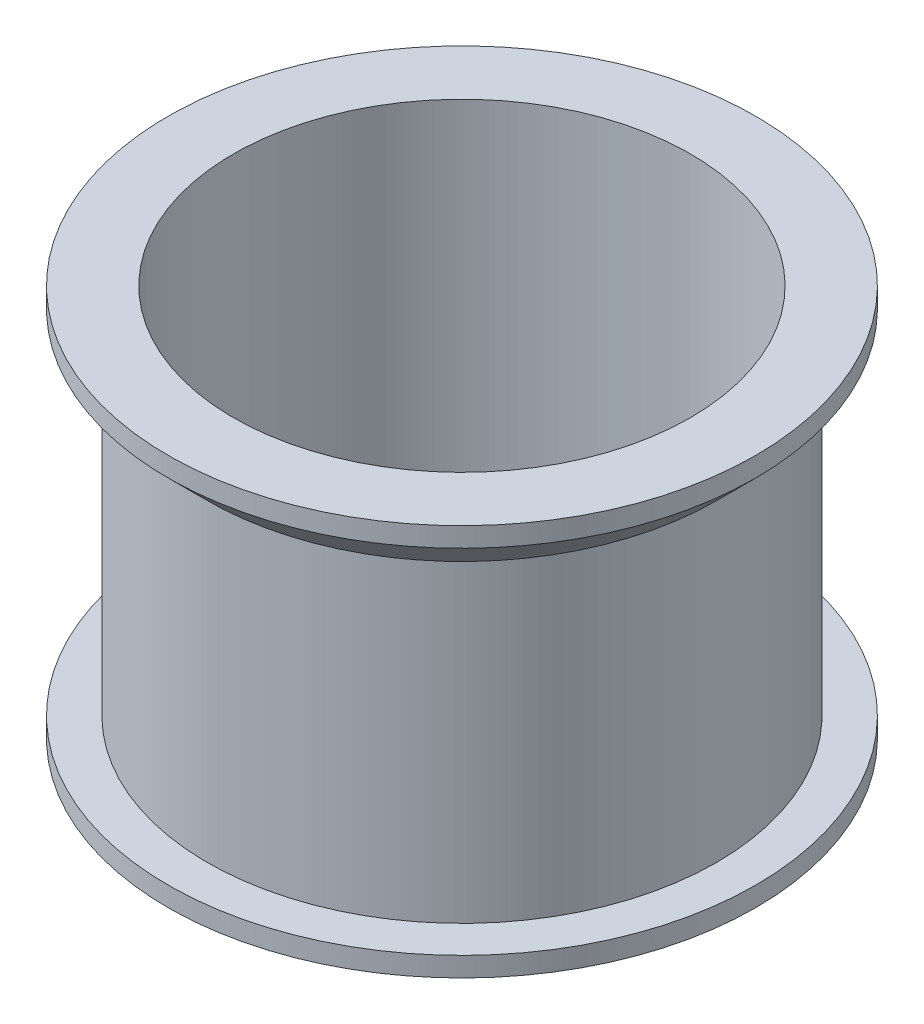
ISO-10303-21;
HEADER;
FILE_DESCRIPTION(('STEP AP214'),'2;1');
FILE_NAME('part.step','',(''),(''),'','','');
FILE_SCHEMA(('AUTOMOTIVE_DESIGN { 1 0 10303 214 1 1 1 1 }'));
ENDSEC;
DATA;
#1=APPLICATION_CONTEXT('core data for automotive mechanical design processes');
#2=APPLICATION_PROTOCOL_DEFINITION('international standard','automotive_design',2000,#1);
#3=PRODUCT_CONTEXT('',#1,'mechanical');
#4=PRODUCT('Part','Part','',(#3));
#5=PRODUCT_RELATED_PRODUCT_CATEGORY('part','',(#4));
#6=PRODUCT_DEFINITION_FORMATION('','',#4);
#7=PRODUCT_DEFINITION_CONTEXT('part definition',#1,'design');
#8=PRODUCT_DEFINITION('design','',#6,#7);
#9=PRODUCT_DEFINITION_SHAPE('','',#8);
#10=(LENGTH_UNIT() NAMED_UNIT(*) SI_UNIT(.MILLI.,.METRE.));
#11=(NAMED_UNIT(*) PLANE_ANGLE_UNIT() SI_UNIT($,.RADIAN.));
#12=(NAMED_UNIT(*) SI_UNIT($,.STERADIAN.) SOLID_ANGLE_UNIT());
#13=UNCERTAINTY_MEASURE_WITH_UNIT(LENGTH_MEASURE(1.E-05),#10,'distance_accuracy_value','');
#14=(GEOMETRIC_REPRESENTATION_CONTEXT(3) GLOBAL_UNCERTAINTY_ASSIGNED_CONTEXT((#13)) GLOBAL_UNIT_ASSIGNED_CONTEXT((#10,
#11,#12)) REPRESENTATION_CONTEXT('',''));
#15=CARTESIAN_POINT('',(0.,0.,0.));
#16=DIRECTION('',(0.,0.,1.));
#17=DIRECTION('',(1.,0.,0.));
#18=AXIS2_PLACEMENT_3D('',#15,#16,#17);
#19=CARTESIAN_POINT('',(0.,166.,45.));
#20=DIRECTION('',(0.,1.,0.));
#21=DIRECTION('',(0.,0.,-1.));
#22=AXIS2_PLACEMENT_3D('',#19,#20,#21);
#23=PLANE('',#22);
#24=CARTESIAN_POINT('',(0.,166.,45.));
#25=DIRECTION('',(0.,1.,0.));
#26=DIRECTION('',(1.,0.,0.));
#27=AXIS2_PLACEMENT_3D('',#24,#25,#26);
#28=CIRCLE('',#27,16.);
#29=CARTESIAN_POINT('',(16.,166.,45.));
#30=VERTEX_POINT('',#29);
#31=EDGE_CURVE('E123',#30,#30,#28,.T.);
#32=ORIENTED_EDGE('',*,*,#31,.F.);
#33=EDGE_LOOP('',(#32));
#34=FACE_BOUND('',#33,.T.);
#35=CARTESIAN_POINT('',(0.,166.,45.));
#36=DIRECTION('',(0.,1.,0.));
#37=DIRECTION('',(1.,0.,0.));
#38=AXIS2_PLACEMENT_3D('',#35,#36,#37);
#39=CIRCLE('',#38,35.);
#40=CARTESIAN_POINT('',(35.,166.,45.));
#41=VERTEX_POINT('',#40);
#42=EDGE_CURVE('E11',#41,#41,#39,.T.);
#43=ORIENTED_EDGE('',*,*,#42,.T.);
#44=EDGE_LOOP('',(#43));
#45=FACE_BOUND('',#44,.T.);
#46=ADVANCED_FACE('F16',(#34,#45),#23,.T.);
#47=CARTESIAN_POINT('',(0.,220.,45.));
#48=DIRECTION('',(0.,-1.,0.));
#49=DIRECTION('',(1.,0.,0.));
#50=AXIS2_PLACEMENT_3D('',#47,#48,#49);
#51=CYLINDRICAL_SURFACE('',#50,35.);
#52=CARTESIAN_POINT('',(0.,220.,45.));
#53=DIRECTION('',(0.,1.,0.));
#54=DIRECTION('',(1.,0.,0.));
#55=AXIS2_PLACEMENT_3D('',#52,#53,#54);
#56=CIRCLE('',#55,35.);
#57=CARTESIAN_POINT('',(35.,220.,45.));
#58=VERTEX_POINT('',#57);
#59=EDGE_CURVE('E183',#58,#58,#56,.T.);
#60=ORIENTED_EDGE('',*,*,#59,.T.);
#61=DIRECTION('',(0.,-1.,0.));
#62=VECTOR('',#61,1.);
#63=CARTESIAN_POINT('',(35.,220.,45.));
#64=LINE('',#63,#62);
#65=EDGE_CURVE('E25',#58,#41,#64,.T.);
#66=ORIENTED_EDGE('',*,*,#65,.T.);
#67=ORIENTED_EDGE('',*,*,#42,.F.);
#68=ORIENTED_EDGE('',*,*,#65,.F.);
#69=EDGE_LOOP('',(#60,#66,#67,#68));
#70=FACE_BOUND('',#69,.T.);
#71=ADVANCED_FACE('F18',(#70),#51,.F.);
#72=CARTESIAN_POINT('',(0.,166.,45.));
#73=DIRECTION('',(0.,1.,0.));
#74=DIRECTION('',(1.,0.,0.));
#75=AXIS2_PLACEMENT_3D('',#72,#73,#74);
#76=CYLINDRICAL_SURFACE('',#75,16.);
#77=ORIENTED_EDGE('',*,*,#31,.T.);
#78=DIRECTION('',(0.,1.,0.));
#79=VECTOR('',#78,1.);
#80=CARTESIAN_POINT('',(16.,166.,45.));
#81=LINE('',#80,#79);
#82=CARTESIAN_POINT('',(16.,180.,45.));
#83=VERTEX_POINT('',#82);
#84=EDGE_CURVE('E42',#30,#83,#81,.T.);
#85=ORIENTED_EDGE('',*,*,#84,.T.);
#86=CARTESIAN_POINT('',(0.,180.,45.));
#87=DIRECTION('',(0.,1.,0.));
#88=DIRECTION('',(1.,0.,0.));
#89=AXIS2_PLACEMENT_3D('',#86,#87,#88);
#90=CIRCLE('',#89,16.);
#91=EDGE_CURVE('E179',#83,#83,#90,.T.);
#92=ORIENTED_EDGE('',*,*,#91,.F.);
#93=ORIENTED_EDGE('',*,*,#84,.F.);
#94=EDGE_LOOP('',(#77,#85,#92,#93));
#95=FACE_BOUND('',#94,.T.);
#96=ADVANCED_FACE('F198',(#95),#76,.T.);
#97=CARTESIAN_POINT('',(0.,220.,45.));
#98=DIRECTION('',(0.,1.,0.));
#99=DIRECTION('',(0.,0.,-1.));
#100=AXIS2_PLACEMENT_3D('',#97,#98,#99);
#101=PLANE('',#100);
#102=ORIENTED_EDGE('',*,*,#59,.F.);
#103=EDGE_LOOP('',(#102));
#104=FACE_BOUND('',#103,.T.);
#105=CARTESIAN_POINT('',(0.,220.,45.));
#106=DIRECTION('',(0.,1.,0.));
#107=DIRECTION('',(1.,0.,0.));
#108=AXIS2_PLACEMENT_3D('',#105,#106,#107);
#109=CIRCLE('',#108,45.);
#110=CARTESIAN_POINT('',(45.,220.,45.));
#111=VERTEX_POINT('',#110);
#112=EDGE_CURVE('E176',#111,#111,#109,.T.);
#113=ORIENTED_EDGE('',*,*,#112,.T.);
#114=EDGE_LOOP('',(#113));
#115=FACE_BOUND('',#114,.T.);
#116=ADVANCED_FACE('F194',(#104,#115),#101,.T.);
#117=CARTESIAN_POINT('',(0.,180.,45.));
#118=DIRECTION('',(0.,1.,0.));
#119=DIRECTION('',(0.,0.,-1.));
#120=AXIS2_PLACEMENT_3D('',#117,#118,#119);
#121=PLANE('',#120);
#122=CARTESIAN_POINT('',(0.,180.,45.));
#123=DIRECTION('',(0.,1.,0.));
#124=DIRECTION('',(1.,0.,0.));
#125=AXIS2_PLACEMENT_3D('',#122,#123,#124);
#126=CIRCLE('',#125,11.1);
#127=CARTESIAN_POINT('',(11.1,180.,45.));
#128=VERTEX_POINT('',#127);
#129=EDGE_CURVE('E162',#128,#128,#126,.T.);
#130=ORIENTED_EDGE('',*,*,#129,.F.);
#131=EDGE_LOOP('',(#130));
#132=FACE_BOUND('',#131,.T.);
#133=ORIENTED_EDGE('',*,*,#91,.T.);
#134=EDGE_LOOP('',(#133));
#135=FACE_BOUND('',#134,.T.);
#136=ADVANCED_FACE('F197',(#132,#135),#121,.T.);
#137=CARTESIAN_POINT('',(0.,217.,45.));
#138=DIRECTION('',(0.,1.,0.));
#139=DIRECTION('',(1.,0.,0.));
#140=AXIS2_PLACEMENT_3D('',#137,#138,#139);
#141=CYLINDRICAL_SURFACE('',#140,45.);
#142=CARTESIAN_POINT('',(0.,217.,45.));
#143=DIRECTION('',(0.,1.,0.));
#144=DIRECTION('',(1.,0.,0.));
#145=AXIS2_PLACEMENT_3D('',#142,#143,#144);
#146=CIRCLE('',#145,45.);
#147=CARTESIAN_POINT('',(45.,217.,45.));
#148=VERTEX_POINT('',#147);
#149=EDGE_CURVE('E126',#148,#148,#146,.T.);
#150=ORIENTED_EDGE('',*,*,#149,.T.);
#151=DIRECTION('',(0.,1.,0.));
#152=VECTOR('',#151,1.);
#153=CARTESIAN_POINT('',(45.,217.,45.));
#154=LINE('',#153,#152);
#155=EDGE_CURVE('E172',#148,#111,#154,.T.);
#156=ORIENTED_EDGE('',*,*,#155,.T.);
#157=ORIENTED_EDGE('',*,*,#112,.F.);
#158=ORIENTED_EDGE('',*,*,#155,.F.);
#159=EDGE_LOOP('',(#150,#156,#157,#158));
#160=FACE_BOUND('',#159,.T.);
#161=ADVANCED_FACE('F202',(#160),#141,.T.);
#162=CARTESIAN_POINT('',(0.,180.,45.));
#163=DIRECTION('',(0.,-1.,0.));
#164=DIRECTION('',(1.,0.,0.));
#165=AXIS2_PLACEMENT_3D('',#162,#163,#164);
#166=CYLINDRICAL_SURFACE('',#165,11.1);
#167=ORIENTED_EDGE('',*,*,#129,.T.);
#168=DIRECTION('',(0.,-1.,0.));
#169=VECTOR('',#168,1.);
#170=CARTESIAN_POINT('',(11.1,180.,45.));
#171=LINE('',#170,#169);
#172=CARTESIAN_POINT('',(11.1,172.8,45.));
#173=VERTEX_POINT('',#172);
#174=EDGE_CURVE('E166',#128,#173,#171,.T.);
#175=ORIENTED_EDGE('',*,*,#174,.T.);
#176=CARTESIAN_POINT('',(0.,172.8,45.));
#177=DIRECTION('',(0.,1.,0.));
#178=DIRECTION('',(1.,0.,0.));
#179=AXIS2_PLACEMENT_3D('',#176,#177,#178);
#180=CIRCLE('',#179,11.1);
#181=EDGE_CURVE('E127',#173,#173,#180,.T.);
#182=ORIENTED_EDGE('',*,*,#181,.F.);
#183=ORIENTED_EDGE('',*,*,#174,.F.);
#184=EDGE_LOOP('',(#167,#175,#182,#183));
#185=FACE_BOUND('',#184,.T.);
#186=ADVANCED_FACE('F240',(#185),#166,.F.);
#187=CARTESIAN_POINT('',(0.,211.,45.));
#188=DIRECTION('',(0.,1.,0.));
#189=DIRECTION('',(1.,0.,0.));
#190=AXIS2_PLACEMENT_3D('',#187,#188,#189);
#191=CONICAL_SURFACE('',#190,39.,0.785398163397);
#192=CARTESIAN_POINT('',(0.,211.,45.));
#193=DIRECTION('',(0.,1.,0.));
#194=DIRECTION('',(1.,0.,0.));
#195=AXIS2_PLACEMENT_3D('',#192,#193,#194);
#196=CIRCLE('',#195,39.);
#197=CARTESIAN_POINT('',(39.,211.,45.));
#198=VERTEX_POINT('',#197);
#199=EDGE_CURVE('E132',#198,#198,#196,.T.);
#200=ORIENTED_EDGE('',*,*,#199,.T.);
#201=DIRECTION('',(0.707106781186548,0.707106781186548,0.));
#202=VECTOR('',#201,1.);
#203=CARTESIAN_POINT('',(39.,211.,45.));
#204=LINE('',#203,#202);
#205=EDGE_CURVE('E124',#198,#148,#204,.T.);
#206=ORIENTED_EDGE('',*,*,#205,.T.);
#207=ORIENTED_EDGE('',*,*,#149,.F.);
#208=ORIENTED_EDGE('',*,*,#205,.F.);
#209=EDGE_LOOP('',(#200,#206,#207,#208));
#210=FACE_BOUND('',#209,.T.);
#211=ADVANCED_FACE('F205',(#210),#191,.T.);
#212=CARTESIAN_POINT('',(0.,172.8,45.));
#213=DIRECTION('',(0.,1.,0.));
#214=DIRECTION('',(0.,0.,-1.));
#215=AXIS2_PLACEMENT_3D('',#212,#213,#214);
#216=PLANE('',#215);
#217=CARTESIAN_POINT('',(0.,172.8,45.));
#218=DIRECTION('',(0.,-1.,0.));
#219=DIRECTION('',(1.,0.,0.));
#220=AXIS2_PLACEMENT_3D('',#217,#218,#219);
#221=CIRCLE('',#220,5.6);
#222=CARTESIAN_POINT('',(5.6,172.8,45.));
#223=VERTEX_POINT('',#222);
#224=EDGE_CURVE('E152',#223,#223,#221,.T.);
#225=ORIENTED_EDGE('',*,*,#224,.T.);
#226=EDGE_LOOP('',(#225));
#227=FACE_BOUND('',#226,.T.);
#228=ORIENTED_EDGE('',*,*,#181,.T.);
#229=EDGE_LOOP('',(#228));
#230=FACE_BOUND('',#229,.T.);
#231=ADVANCED_FACE('F246',(#227,#230),#216,.T.);
#232=CARTESIAN_POINT('',(0.,163.,45.));
#233=DIRECTION('',(0.,1.,0.));
#234=DIRECTION('',(1.,0.,0.));
#235=AXIS2_PLACEMENT_3D('',#232,#233,#234);
#236=CYLINDRICAL_SURFACE('',#235,39.);
#237=CARTESIAN_POINT('',(0.,163.,45.));
#238=DIRECTION('',(0.,1.,0.));
#239=DIRECTION('',(1.,0.,0.));
#240=AXIS2_PLACEMENT_3D('',#237,#238,#239);
#241=CIRCLE('',#240,39.);
#242=CARTESIAN_POINT('',(39.,163.,45.));
#243=VERTEX_POINT('',#242);
#244=EDGE_CURVE('E139',#243,#243,#241,.T.);
#245=ORIENTED_EDGE('',*,*,#244,.T.);
#246=DIRECTION('',(0.,1.,0.));
#247=VECTOR('',#246,1.);
#248=CARTESIAN_POINT('',(39.,163.,45.));
#249=LINE('',#248,#247);
#250=EDGE_CURVE('E155',#243,#198,#249,.T.);
#251=ORIENTED_EDGE('',*,*,#250,.T.);
#252=ORIENTED_EDGE('',*,*,#199,.F.);
#253=ORIENTED_EDGE('',*,*,#250,.F.);
#254=EDGE_LOOP('',(#245,#251,#252,#253));
#255=FACE_BOUND('',#254,.T.);
#256=ADVANCED_FACE('F208',(#255),#236,.T.);
#257=CARTESIAN_POINT('',(0.,173.,45.));
#258=DIRECTION('',(0.,-1.,0.));
#259=DIRECTION('',(1.,0.,0.));
#260=AXIS2_PLACEMENT_3D('',#257,#258,#259);
#261=CYLINDRICAL_SURFACE('',#260,5.6);
#262=DIRECTION('',(0.,-1.,0.));
#263=VECTOR('',#262,1.);
#264=CARTESIAN_POINT('',(5.6,173.,45.));
#265=LINE('',#264,#263);
#266=CARTESIAN_POINT('',(5.6,167.2,45.));
#267=VERTEX_POINT('',#266);
#268=EDGE_CURVE('E143',#223,#267,#265,.T.);
#269=ORIENTED_EDGE('',*,*,#268,.F.);
#270=ORIENTED_EDGE('',*,*,#224,.F.);
#271=ORIENTED_EDGE('',*,*,#268,.T.);
#272=CARTESIAN_POINT('',(0.,167.2,45.));
#273=DIRECTION('',(0.,-1.,0.));
#274=DIRECTION('',(1.,0.,0.));
#275=AXIS2_PLACEMENT_3D('',#272,#273,#274);
#276=CIRCLE('',#275,5.6);
#277=EDGE_CURVE('E144',#267,#267,#276,.T.);
#278=ORIENTED_EDGE('',*,*,#277,.T.);
#279=EDGE_LOOP('',(#269,#270,#271,#278));
#280=FACE_BOUND('',#279,.T.);
#281=ADVANCED_FACE('F215',(#280),#261,.F.);
#282=CARTESIAN_POINT('',(0.,163.,45.));
#283=DIRECTION('',(0.,1.,0.));
#284=DIRECTION('',(0.,0.,-1.));
#285=AXIS2_PLACEMENT_3D('',#282,#283,#284);
#286=PLANE('',#285);
#287=ORIENTED_EDGE('',*,*,#244,.F.);
#288=EDGE_LOOP('',(#287));
#289=FACE_BOUND('',#288,.T.);
#290=CARTESIAN_POINT('',(0.,163.,45.));
#291=DIRECTION('',(0.,1.,0.));
#292=DIRECTION('',(1.,0.,0.));
#293=AXIS2_PLACEMENT_3D('',#290,#291,#292);
#294=CIRCLE('',#293,45.);
#295=CARTESIAN_POINT('',(45.,163.,45.));
#296=VERTEX_POINT('',#295);
#297=EDGE_CURVE('E137',#296,#296,#294,.T.);
#298=ORIENTED_EDGE('',*,*,#297,.T.);
#299=EDGE_LOOP('',(#298));
#300=FACE_BOUND('',#299,.T.);
#301=ADVANCED_FACE('F211',(#289,#300),#286,.T.);
#302=CARTESIAN_POINT('',(0.,167.2,45.));
#303=DIRECTION('',(0.,1.,0.));
#304=DIRECTION('',(0.,0.,-1.));
#305=AXIS2_PLACEMENT_3D('',#302,#303,#304);
#306=PLANE('',#305);
#307=ORIENTED_EDGE('',*,*,#277,.F.);
#308=EDGE_LOOP('',(#307));
#309=FACE_BOUND('',#308,.T.);
#310=CARTESIAN_POINT('',(0.,167.2,45.));
#311=DIRECTION('',(0.,1.,0.));
#312=DIRECTION('',(1.,0.,0.));
#313=AXIS2_PLACEMENT_3D('',#310,#311,#312);
#314=CIRCLE('',#313,11.1);
#315=CARTESIAN_POINT('',(11.1,167.2,45.));
#316=VERTEX_POINT('',#315);
#317=EDGE_CURVE('E106',#316,#316,#314,.T.);
#318=ORIENTED_EDGE('',*,*,#317,.F.);
#319=EDGE_LOOP('',(#318));
#320=FACE_BOUND('',#319,.T.);
#321=ADVANCED_FACE('F214',(#309,#320),#306,.F.);
#322=CARTESIAN_POINT('',(0.,160.,45.));
#323=DIRECTION('',(0.,1.,0.));
#324=DIRECTION('',(1.,0.,0.));
#325=AXIS2_PLACEMENT_3D('',#322,#323,#324);
#326=CYLINDRICAL_SURFACE('',#325,45.);
#327=CARTESIAN_POINT('',(0.,160.,45.));
#328=DIRECTION('',(0.,1.,0.));
#329=DIRECTION('',(1.,0.,0.));
#330=AXIS2_PLACEMENT_3D('',#327,#328,#329);
#331=CIRCLE('',#330,45.);
#332=CARTESIAN_POINT('',(45.,160.,45.));
#333=VERTEX_POINT('',#332);
#334=EDGE_CURVE('E113',#333,#333,#331,.T.);
#335=ORIENTED_EDGE('',*,*,#334,.T.);
#336=DIRECTION('',(0.,1.,0.));
#337=VECTOR('',#336,1.);
#338=CARTESIAN_POINT('',(45.,160.,45.));
#339=LINE('',#338,#337);
#340=EDGE_CURVE('E108',#333,#296,#339,.T.);
#341=ORIENTED_EDGE('',*,*,#340,.T.);
#342=ORIENTED_EDGE('',*,*,#297,.F.);
#343=ORIENTED_EDGE('',*,*,#340,.F.);
#344=EDGE_LOOP('',(#335,#341,#342,#343));
#345=FACE_BOUND('',#344,.T.);
#346=ADVANCED_FACE('F219',(#345),#326,.T.);
#347=CARTESIAN_POINT('',(0.,167.2,45.));
#348=DIRECTION('',(0.,-1.,0.));
#349=DIRECTION('',(1.,0.,0.));
#350=AXIS2_PLACEMENT_3D('',#347,#348,#349);
#351=CYLINDRICAL_SURFACE('',#350,11.1);
#352=ORIENTED_EDGE('',*,*,#317,.T.);
#353=DIRECTION('',(0.,-1.,0.));
#354=VECTOR('',#353,1.);
#355=CARTESIAN_POINT('',(11.1,167.2,45.));
#356=LINE('',#355,#354);
#357=CARTESIAN_POINT('',(11.1,160.,45.));
#358=VERTEX_POINT('',#357);
#359=EDGE_CURVE('E101',#316,#358,#356,.T.);
#360=ORIENTED_EDGE('',*,*,#359,.T.);
#361=CARTESIAN_POINT('',(0.,160.,45.));
#362=DIRECTION('',(0.,1.,0.));
#363=DIRECTION('',(1.,0.,0.));
#364=AXIS2_PLACEMENT_3D('',#361,#362,#363);
#365=CIRCLE('',#364,11.1);
#366=EDGE_CURVE('E104',#358,#358,#365,.T.);
#367=ORIENTED_EDGE('',*,*,#366,.F.);
#368=ORIENTED_EDGE('',*,*,#359,.F.);
#369=EDGE_LOOP('',(#352,#360,#367,#368));
#370=FACE_BOUND('',#369,.T.);
#371=ADVANCED_FACE('F103',(#370),#351,.F.);
#372=CARTESIAN_POINT('',(0.,160.,45.));
#373=DIRECTION('',(0.,1.,0.));
#374=DIRECTION('',(0.,0.,-1.));
#375=AXIS2_PLACEMENT_3D('',#372,#373,#374);
#376=PLANE('',#375);
#377=ORIENTED_EDGE('',*,*,#334,.F.);
#378=EDGE_LOOP('',(#377));
#379=FACE_BOUND('',#378,.T.);
#380=ORIENTED_EDGE('',*,*,#366,.T.);
#381=EDGE_LOOP('',(#380));
#382=FACE_BOUND('',#381,.T.);
#383=ADVANCED_FACE('F111',(#379,#382),#376,.F.);
#384=CLOSED_SHELL('',(#46,#71,#96,#116,#136,#161,#186,#211,#231,#256,#281,#301,#321,#346,#371,#383));
#385=MANIFOLD_SOLID_BREP('B1',#384);
#386=ADVANCED_BREP_SHAPE_REPRESENTATION('',(#18,#385),#14);
#387=SHAPE_DEFINITION_REPRESENTATION(#9,#386);
ENDSEC;
END-ISO-10303-21;
